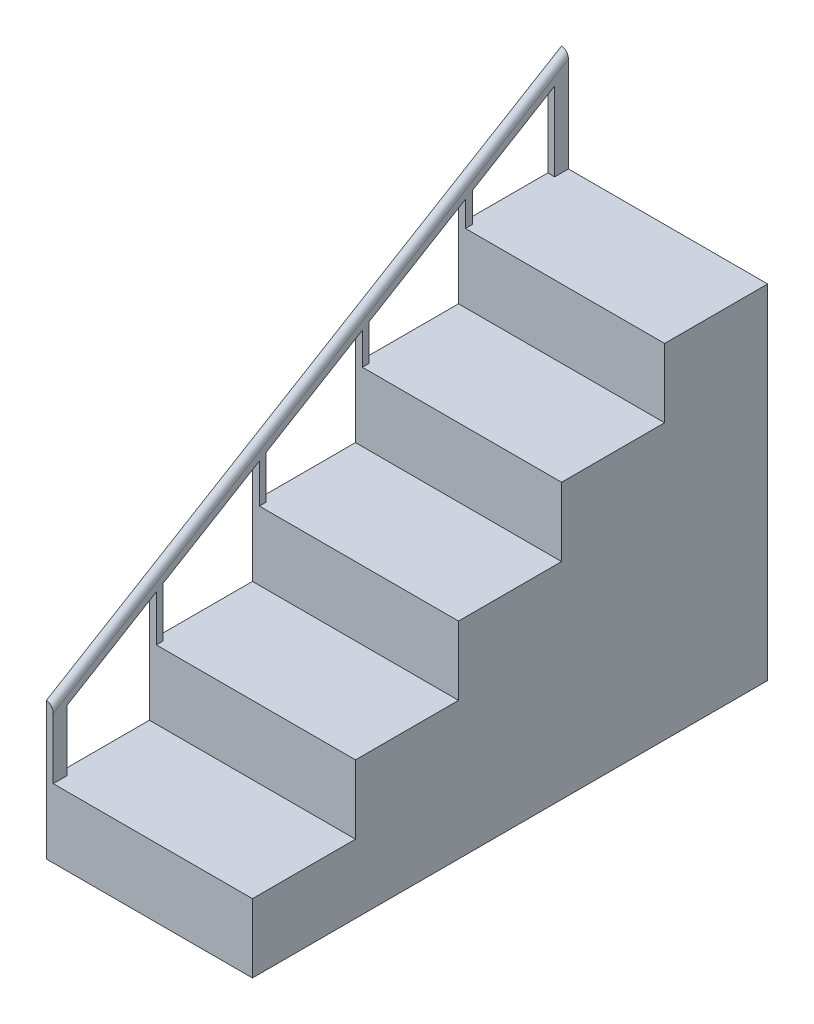
ISO-10303-21;
HEADER;
FILE_DESCRIPTION(('STEP AP214'),'2;1');
FILE_NAME('part.step','',(''),(''),'','','');
FILE_SCHEMA(('AUTOMOTIVE_DESIGN { 1 0 10303 214 1 1 1 1 }'));
ENDSEC;
DATA;
#1=APPLICATION_CONTEXT('core data for automotive mechanical design processes');
#2=APPLICATION_PROTOCOL_DEFINITION('international standard','automotive_design',2000,#1);
#3=PRODUCT_CONTEXT('',#1,'mechanical');
#4=PRODUCT('Part','Part','',(#3));
#5=PRODUCT_RELATED_PRODUCT_CATEGORY('part','',(#4));
#6=PRODUCT_DEFINITION_FORMATION('','',#4);
#7=PRODUCT_DEFINITION_CONTEXT('part definition',#1,'design');
#8=PRODUCT_DEFINITION('design','',#6,#7);
#9=PRODUCT_DEFINITION_SHAPE('','',#8);
#10=(LENGTH_UNIT() NAMED_UNIT(*) SI_UNIT(.MILLI.,.METRE.));
#11=(NAMED_UNIT(*) PLANE_ANGLE_UNIT() SI_UNIT($,.RADIAN.));
#12=(NAMED_UNIT(*) SI_UNIT($,.STERADIAN.) SOLID_ANGLE_UNIT());
#13=UNCERTAINTY_MEASURE_WITH_UNIT(LENGTH_MEASURE(1.E-05),#10,'distance_accuracy_value','');
#14=(GEOMETRIC_REPRESENTATION_CONTEXT(3) GLOBAL_UNCERTAINTY_ASSIGNED_CONTEXT((#13)) GLOBAL_UNIT_ASSIGNED_CONTEXT((#10,
#11,#12)) REPRESENTATION_CONTEXT('',''));
#15=CARTESIAN_POINT('',(0.,0.,0.));
#16=DIRECTION('',(0.,0.,1.));
#17=DIRECTION('',(1.,0.,0.));
#18=AXIS2_PLACEMENT_3D('',#15,#16,#17);
#19=CARTESIAN_POINT('',(10.,614.676192420619,-730.));
#20=DIRECTION('',(0.,-0.857492925712544,-0.514495755427526));
#21=DIRECTION('',(0.,0.514495755427527,-0.857492925712544));
#22=AXIS2_PLACEMENT_3D('',#19,#20,#21);
#23=PLANE('',#22);
#24=DIRECTION('',(-1.,0.,0.));
#25=VECTOR('',#24,1.);
#26=CARTESIAN_POINT('',(10.,542.676192420619,-610.));
#27=LINE('',#26,#25);
#28=CARTESIAN_POINT('',(10.,542.676192420619,-610.));
#29=VERTEX_POINT('',#28);
#30=CARTESIAN_POINT('',(0.,542.676192420619,-610.));
#31=VERTEX_POINT('',#30);
#32=EDGE_CURVE('E263',#29,#31,#27,.T.);
#33=ORIENTED_EDGE('',*,*,#32,.T.);
#34=DIRECTION('',(0.,-0.514495755427527,0.857492925712544));
#35=VECTOR('',#34,1.);
#36=CARTESIAN_POINT('',(0.,614.676192420619,-730.));
#37=LINE('',#36,#35);
#38=CARTESIAN_POINT('',(0.,614.676192420619,-730.));
#39=VERTEX_POINT('',#38);
#40=EDGE_CURVE('E395',#39,#31,#37,.T.);
#41=ORIENTED_EDGE('',*,*,#40,.F.);
#42=DIRECTION('',(-1.,0.,0.));
#43=VECTOR('',#42,1.);
#44=CARTESIAN_POINT('',(10.,614.676192420619,-730.));
#45=LINE('',#44,#43);
#46=CARTESIAN_POINT('',(10.,614.676192420619,-730.));
#47=VERTEX_POINT('',#46);
#48=EDGE_CURVE('E415',#47,#39,#45,.T.);
#49=ORIENTED_EDGE('',*,*,#48,.F.);
#50=DIRECTION('',(0.,-0.514495755427527,0.857492925712544));
#51=VECTOR('',#50,1.);
#52=CARTESIAN_POINT('',(10.,614.676192420619,-730.));
#53=LINE('',#52,#51);
#54=EDGE_CURVE('E252',#47,#29,#53,.T.);
#55=ORIENTED_EDGE('',*,*,#54,.T.);
#56=EDGE_LOOP('',(#33,#41,#49,#55));
#57=FACE_BOUND('',#56,.T.);
#58=ADVANCED_FACE('F44',(#57),#23,.T.);
#59=DIRECTION('',(-1.,0.,0.));
#60=VECTOR('',#59,1.);
#61=CARTESIAN_POINT('',(10.,536.676192420619,-600.));
#62=LINE('',#61,#60);
#63=CARTESIAN_POINT('',(10.,536.676192420619,-600.));
#64=VERTEX_POINT('',#63);
#65=CARTESIAN_POINT('',(0.,536.676192420619,-600.));
#66=VERTEX_POINT('',#65);
#67=EDGE_CURVE('E257',#64,#66,#62,.T.);
#68=ORIENTED_EDGE('',*,*,#67,.F.);
#69=CARTESIAN_POINT('',(10.,452.676192420619,-460.));
#70=VERTEX_POINT('',#69);
#71=EDGE_CURVE('E240',#64,#70,#53,.T.);
#72=ORIENTED_EDGE('',*,*,#71,.T.);
#73=DIRECTION('',(-1.,0.,0.));
#74=VECTOR('',#73,1.);
#75=CARTESIAN_POINT('',(10.,452.676192420619,-460.));
#76=LINE('',#75,#74);
#77=CARTESIAN_POINT('',(0.,452.676192420619,-460.));
#78=VERTEX_POINT('',#77);
#79=EDGE_CURVE('E296',#70,#78,#76,.T.);
#80=ORIENTED_EDGE('',*,*,#79,.T.);
#81=EDGE_CURVE('E260',#66,#78,#37,.T.);
#82=ORIENTED_EDGE('',*,*,#81,.F.);
#83=EDGE_LOOP('',(#68,#72,#80,#82));
#84=FACE_BOUND('',#83,.T.);
#85=ADVANCED_FACE('F258',(#84),#23,.T.);
#86=DIRECTION('',(-1.,0.,0.));
#87=VECTOR('',#86,1.);
#88=CARTESIAN_POINT('',(10.,446.676192420619,-450.));
#89=LINE('',#88,#87);
#90=CARTESIAN_POINT('',(10.,446.676192420619,-450.));
#91=VERTEX_POINT('',#90);
#92=CARTESIAN_POINT('',(0.,446.676192420619,-450.));
#93=VERTEX_POINT('',#92);
#94=EDGE_CURVE('E292',#91,#93,#89,.T.);
#95=ORIENTED_EDGE('',*,*,#94,.F.);
#96=CARTESIAN_POINT('',(10.,362.676192420619,-310.));
#97=VERTEX_POINT('',#96);
#98=EDGE_CURVE('E253',#91,#97,#53,.T.);
#99=ORIENTED_EDGE('',*,*,#98,.T.);
#100=DIRECTION('',(-1.,0.,0.));
#101=VECTOR('',#100,1.);
#102=CARTESIAN_POINT('',(10.,362.676192420619,-310.));
#103=LINE('',#102,#101);
#104=CARTESIAN_POINT('',(0.,362.676192420619,-310.));
#105=VERTEX_POINT('',#104);
#106=EDGE_CURVE('E321',#97,#105,#103,.T.);
#107=ORIENTED_EDGE('',*,*,#106,.T.);
#108=EDGE_CURVE('E548',#93,#105,#37,.T.);
#109=ORIENTED_EDGE('',*,*,#108,.F.);
#110=EDGE_LOOP('',(#95,#99,#107,#109));
#111=FACE_BOUND('',#110,.T.);
#112=ADVANCED_FACE('F629',(#111),#23,.T.);
#113=DIRECTION('',(-1.,0.,0.));
#114=VECTOR('',#113,1.);
#115=CARTESIAN_POINT('',(10.,356.676192420619,-300.));
#116=LINE('',#115,#114);
#117=CARTESIAN_POINT('',(10.,356.676192420619,-300.));
#118=VERTEX_POINT('',#117);
#119=CARTESIAN_POINT('',(0.,356.676192420619,-300.));
#120=VERTEX_POINT('',#119);
#121=EDGE_CURVE('E316',#118,#120,#116,.T.);
#122=ORIENTED_EDGE('',*,*,#121,.F.);
#123=CARTESIAN_POINT('',(10.,272.676192420619,-160.));
#124=VERTEX_POINT('',#123);
#125=EDGE_CURVE('E544',#118,#124,#53,.T.);
#126=ORIENTED_EDGE('',*,*,#125,.T.);
#127=DIRECTION('',(-1.,0.,0.));
#128=VECTOR('',#127,1.);
#129=CARTESIAN_POINT('',(10.,272.676192420619,-160.));
#130=LINE('',#129,#128);
#131=CARTESIAN_POINT('',(0.,272.676192420619,-160.));
#132=VERTEX_POINT('',#131);
#133=EDGE_CURVE('E347',#124,#132,#130,.T.);
#134=ORIENTED_EDGE('',*,*,#133,.T.);
#135=EDGE_CURVE('E551',#120,#132,#37,.T.);
#136=ORIENTED_EDGE('',*,*,#135,.F.);
#137=EDGE_LOOP('',(#122,#126,#134,#136));
#138=FACE_BOUND('',#137,.T.);
#139=ADVANCED_FACE('F608',(#138),#23,.T.);
#140=CARTESIAN_POINT('',(300.,0.,-750.));
#141=DIRECTION('',(0.,1.,0.));
#142=DIRECTION('',(0.,0.,1.));
#143=AXIS2_PLACEMENT_3D('',#140,#141,#142);
#144=PLANE('',#143);
#145=DIRECTION('',(0.,0.,-1.));
#146=VECTOR('',#145,1.);
#147=CARTESIAN_POINT('',(0.,0.,-750.));
#148=LINE('',#147,#146);
#149=CARTESIAN_POINT('',(0.,0.,0.));
#150=VERTEX_POINT('',#149);
#151=CARTESIAN_POINT('',(0.,0.,-750.));
#152=VERTEX_POINT('',#151);
#153=EDGE_CURVE('E410',#150,#152,#148,.T.);
#154=ORIENTED_EDGE('',*,*,#153,.T.);
#155=DIRECTION('',(-1.,0.,0.));
#156=VECTOR('',#155,1.);
#157=CARTESIAN_POINT('',(300.,0.,-750.));
#158=LINE('',#157,#156);
#159=CARTESIAN_POINT('',(300.,0.,-750.));
#160=VERTEX_POINT('',#159);
#161=EDGE_CURVE('E536',#160,#152,#158,.T.);
#162=ORIENTED_EDGE('',*,*,#161,.F.);
#163=DIRECTION('',(0.,0.,-1.));
#164=VECTOR('',#163,1.);
#165=CARTESIAN_POINT('',(300.,0.,-750.));
#166=LINE('',#165,#164);
#167=CARTESIAN_POINT('',(300.,0.,0.));
#168=VERTEX_POINT('',#167);
#169=EDGE_CURVE('E421',#168,#160,#166,.T.);
#170=ORIENTED_EDGE('',*,*,#169,.F.);
#171=DIRECTION('',(-1.,0.,0.));
#172=VECTOR('',#171,1.);
#173=CARTESIAN_POINT('',(300.,0.,0.));
#174=LINE('',#173,#172);
#175=EDGE_CURVE('E459',#168,#150,#174,.T.);
#176=ORIENTED_EDGE('',*,*,#175,.T.);
#177=EDGE_LOOP('',(#154,#162,#170,#176));
#178=FACE_BOUND('',#177,.T.);
#179=ADVANCED_FACE('F583',(#178),#144,.F.);
#180=CARTESIAN_POINT('',(300.,500.,-750.));
#181=DIRECTION('',(0.,0.,1.));
#182=DIRECTION('',(1.,0.,0.));
#183=AXIS2_PLACEMENT_3D('',#180,#181,#182);
#184=PLANE('',#183);
#185=DIRECTION('',(0.,1.,0.));
#186=VECTOR('',#185,1.);
#187=CARTESIAN_POINT('',(0.,500.,-750.));
#188=LINE('',#187,#186);
#189=CARTESIAN_POINT('',(0.,650.,-750.));
#190=VERTEX_POINT('',#189);
#191=EDGE_CURVE('E463',#152,#190,#188,.T.);
#192=ORIENTED_EDGE('',*,*,#191,.T.);
#193=CARTESIAN_POINT('',(0.,638.338096210309,-750.));
#194=DIRECTION('',(0.,0.,1.));
#195=DIRECTION('',(0.,-1.,0.));
#196=AXIS2_PLACEMENT_3D('',#193,#194,#195);
#197=ELLIPSE('',#196,11.6619037896906,10.);
#198=CARTESIAN_POINT('',(10.,638.338096210309,-750.));
#199=VERTEX_POINT('',#198);
#200=EDGE_CURVE('E67',#190,#199,#197,.F.);
#201=ORIENTED_EDGE('',*,*,#200,.T.);
#202=DIRECTION('',(0.,-1.,0.));
#203=VECTOR('',#202,1.);
#204=CARTESIAN_POINT('',(10.,500.,-750.));
#205=LINE('',#204,#203);
#206=CARTESIAN_POINT('',(10.,500.,-750.));
#207=VERTEX_POINT('',#206);
#208=EDGE_CURVE('E387',#199,#207,#205,.T.);
#209=ORIENTED_EDGE('',*,*,#208,.T.);
#210=DIRECTION('',(-1.,0.,0.));
#211=VECTOR('',#210,1.);
#212=CARTESIAN_POINT('',(300.,500.,-750.));
#213=LINE('',#212,#211);
#214=CARTESIAN_POINT('',(300.,500.,-750.));
#215=VERTEX_POINT('',#214);
#216=EDGE_CURVE('E532',#215,#207,#213,.T.);
#217=ORIENTED_EDGE('',*,*,#216,.F.);
#218=DIRECTION('',(0.,1.,0.));
#219=VECTOR('',#218,1.);
#220=CARTESIAN_POINT('',(300.,500.,-750.));
#221=LINE('',#220,#219);
#222=EDGE_CURVE('E425',#160,#215,#221,.T.);
#223=ORIENTED_EDGE('',*,*,#222,.F.);
#224=ORIENTED_EDGE('',*,*,#161,.T.);
#225=EDGE_LOOP('',(#192,#201,#209,#217,#223,#224));
#226=FACE_BOUND('',#225,.T.);
#227=ADVANCED_FACE('F663',(#226),#184,.F.);
#228=CARTESIAN_POINT('',(300.,500.,-600.));
#229=DIRECTION('',(0.,-1.,0.));
#230=DIRECTION('',(0.,0.,-1.));
#231=AXIS2_PLACEMENT_3D('',#228,#229,#230);
#232=PLANE('',#231);
#233=DIRECTION('',(0.,0.,1.));
#234=VECTOR('',#233,1.);
#235=CARTESIAN_POINT('',(0.,500.,-600.));
#236=LINE('',#235,#234);
#237=CARTESIAN_POINT('',(0.,500.,-730.));
#238=VERTEX_POINT('',#237);
#239=CARTESIAN_POINT('',(0.,500.,-610.));
#240=VERTEX_POINT('',#239);
#241=EDGE_CURVE('E466',#238,#240,#236,.T.);
#242=ORIENTED_EDGE('',*,*,#241,.T.);
#243=DIRECTION('',(-1.,0.,0.));
#244=VECTOR('',#243,1.);
#245=CARTESIAN_POINT('',(10.,500.,-610.));
#246=LINE('',#245,#244);
#247=CARTESIAN_POINT('',(10.,500.,-610.));
#248=VERTEX_POINT('',#247);
#249=EDGE_CURVE('E285',#248,#240,#246,.T.);
#250=ORIENTED_EDGE('',*,*,#249,.F.);
#251=DIRECTION('',(0.,0.,1.));
#252=VECTOR('',#251,1.);
#253=CARTESIAN_POINT('',(10.,500.,-610.));
#254=LINE('',#253,#252);
#255=CARTESIAN_POINT('',(10.,500.,-600.));
#256=VERTEX_POINT('',#255);
#257=EDGE_CURVE('E272',#248,#256,#254,.T.);
#258=ORIENTED_EDGE('',*,*,#257,.T.);
#259=DIRECTION('',(-1.,0.,0.));
#260=VECTOR('',#259,1.);
#261=CARTESIAN_POINT('',(300.,500.,-600.));
#262=LINE('',#261,#260);
#263=CARTESIAN_POINT('',(300.,500.,-600.));
#264=VERTEX_POINT('',#263);
#265=EDGE_CURVE('E270',#264,#256,#262,.T.);
#266=ORIENTED_EDGE('',*,*,#265,.F.);
#267=DIRECTION('',(0.,0.,1.));
#268=VECTOR('',#267,1.);
#269=CARTESIAN_POINT('',(300.,500.,-600.));
#270=LINE('',#269,#268);
#271=EDGE_CURVE('E429',#215,#264,#270,.T.);
#272=ORIENTED_EDGE('',*,*,#271,.F.);
#273=ORIENTED_EDGE('',*,*,#216,.T.);
#274=DIRECTION('',(0.,0.,1.));
#275=VECTOR('',#274,1.);
#276=CARTESIAN_POINT('',(10.,500.,-750.));
#277=LINE('',#276,#275);
#278=CARTESIAN_POINT('',(10.,500.,-730.));
#279=VERTEX_POINT('',#278);
#280=EDGE_CURVE('E367',#207,#279,#277,.T.);
#281=ORIENTED_EDGE('',*,*,#280,.T.);
#282=DIRECTION('',(-1.,0.,0.));
#283=VECTOR('',#282,1.);
#284=CARTESIAN_POINT('',(10.,500.,-730.));
#285=LINE('',#284,#283);
#286=EDGE_CURVE('E390',#279,#238,#285,.T.);
#287=ORIENTED_EDGE('',*,*,#286,.T.);
#288=EDGE_LOOP('',(#242,#250,#258,#266,#272,#273,#281,#287));
#289=FACE_BOUND('',#288,.T.);
#290=ADVANCED_FACE('F648',(#289),#232,.F.);
#291=CARTESIAN_POINT('',(300.,400.,-600.));
#292=DIRECTION('',(0.,0.,-1.));
#293=DIRECTION('',(-1.,0.,0.));
#294=AXIS2_PLACEMENT_3D('',#291,#292,#293);
#295=PLANE('',#294);
#296=DIRECTION('',(0.,-1.,0.));
#297=VECTOR('',#296,1.);
#298=CARTESIAN_POINT('',(0.,400.,-600.));
#299=LINE('',#298,#297);
#300=CARTESIAN_POINT('',(0.,400.,-600.));
#301=VERTEX_POINT('',#300);
#302=EDGE_CURVE('E469',#66,#301,#299,.T.);
#303=ORIENTED_EDGE('',*,*,#302,.T.);
#304=DIRECTION('',(-1.,0.,0.));
#305=VECTOR('',#304,1.);
#306=CARTESIAN_POINT('',(300.,400.,-600.));
#307=LINE('',#306,#305);
#308=CARTESIAN_POINT('',(300.,400.,-600.));
#309=VERTEX_POINT('',#308);
#310=EDGE_CURVE('E526',#309,#301,#307,.T.);
#311=ORIENTED_EDGE('',*,*,#310,.F.);
#312=DIRECTION('',(0.,-1.,0.));
#313=VECTOR('',#312,1.);
#314=CARTESIAN_POINT('',(300.,400.,-600.));
#315=LINE('',#314,#313);
#316=EDGE_CURVE('E432',#264,#309,#315,.T.);
#317=ORIENTED_EDGE('',*,*,#316,.F.);
#318=ORIENTED_EDGE('',*,*,#265,.T.);
#319=DIRECTION('',(0.,1.,0.));
#320=VECTOR('',#319,1.);
#321=CARTESIAN_POINT('',(10.,500.,-600.));
#322=LINE('',#321,#320);
#323=EDGE_CURVE('E245',#256,#64,#322,.T.);
#324=ORIENTED_EDGE('',*,*,#323,.T.);
#325=ORIENTED_EDGE('',*,*,#67,.T.);
#326=EDGE_LOOP('',(#303,#311,#317,#318,#324,#325));
#327=FACE_BOUND('',#326,.T.);
#328=ADVANCED_FACE('F267',(#327),#295,.F.);
#329=CARTESIAN_POINT('',(300.,400.,-450.));
#330=DIRECTION('',(0.,-1.,0.));
#331=DIRECTION('',(0.,0.,-1.));
#332=AXIS2_PLACEMENT_3D('',#329,#330,#331);
#333=PLANE('',#332);
#334=DIRECTION('',(0.,0.,1.));
#335=VECTOR('',#334,1.);
#336=CARTESIAN_POINT('',(0.,400.,-450.));
#337=LINE('',#336,#335);
#338=CARTESIAN_POINT('',(0.,400.,-460.));
#339=VERTEX_POINT('',#338);
#340=EDGE_CURVE('E472',#301,#339,#337,.T.);
#341=ORIENTED_EDGE('',*,*,#340,.T.);
#342=DIRECTION('',(-1.,0.,0.));
#343=VECTOR('',#342,1.);
#344=CARTESIAN_POINT('',(10.,400.,-460.));
#345=LINE('',#344,#343);
#346=CARTESIAN_POINT('',(10.,400.,-460.));
#347=VERTEX_POINT('',#346);
#348=EDGE_CURVE('E299',#347,#339,#345,.T.);
#349=ORIENTED_EDGE('',*,*,#348,.F.);
#350=DIRECTION('',(0.,0.,1.));
#351=VECTOR('',#350,1.);
#352=CARTESIAN_POINT('',(10.,400.,-460.));
#353=LINE('',#352,#351);
#354=CARTESIAN_POINT('',(10.,400.,-450.));
#355=VERTEX_POINT('',#354);
#356=EDGE_CURVE('E307',#347,#355,#353,.T.);
#357=ORIENTED_EDGE('',*,*,#356,.T.);
#358=DIRECTION('',(-1.,0.,0.));
#359=VECTOR('',#358,1.);
#360=CARTESIAN_POINT('',(300.,400.,-450.));
#361=LINE('',#360,#359);
#362=CARTESIAN_POINT('',(300.,400.,-450.));
#363=VERTEX_POINT('',#362);
#364=EDGE_CURVE('E522',#363,#355,#361,.T.);
#365=ORIENTED_EDGE('',*,*,#364,.F.);
#366=DIRECTION('',(0.,0.,1.));
#367=VECTOR('',#366,1.);
#368=CARTESIAN_POINT('',(300.,400.,-450.));
#369=LINE('',#368,#367);
#370=EDGE_CURVE('E435',#309,#363,#369,.T.);
#371=ORIENTED_EDGE('',*,*,#370,.F.);
#372=ORIENTED_EDGE('',*,*,#310,.T.);
#373=EDGE_LOOP('',(#341,#349,#357,#365,#371,#372));
#374=FACE_BOUND('',#373,.T.);
#375=ADVANCED_FACE('F638',(#374),#333,.F.);
#376=CARTESIAN_POINT('',(300.,300.,-450.));
#377=DIRECTION('',(0.,0.,-1.));
#378=DIRECTION('',(-1.,0.,0.));
#379=AXIS2_PLACEMENT_3D('',#376,#377,#378);
#380=PLANE('',#379);
#381=DIRECTION('',(0.,-1.,0.));
#382=VECTOR('',#381,1.);
#383=CARTESIAN_POINT('',(0.,300.,-450.));
#384=LINE('',#383,#382);
#385=CARTESIAN_POINT('',(0.,300.,-450.));
#386=VERTEX_POINT('',#385);
#387=EDGE_CURVE('E475',#93,#386,#384,.T.);
#388=ORIENTED_EDGE('',*,*,#387,.T.);
#389=DIRECTION('',(-1.,0.,0.));
#390=VECTOR('',#389,1.);
#391=CARTESIAN_POINT('',(300.,300.,-450.));
#392=LINE('',#391,#390);
#393=CARTESIAN_POINT('',(300.,300.,-450.));
#394=VERTEX_POINT('',#393);
#395=EDGE_CURVE('E518',#394,#386,#392,.T.);
#396=ORIENTED_EDGE('',*,*,#395,.F.);
#397=DIRECTION('',(0.,-1.,0.));
#398=VECTOR('',#397,1.);
#399=CARTESIAN_POINT('',(300.,300.,-450.));
#400=LINE('',#399,#398);
#401=EDGE_CURVE('E438',#363,#394,#400,.T.);
#402=ORIENTED_EDGE('',*,*,#401,.F.);
#403=ORIENTED_EDGE('',*,*,#364,.T.);
#404=DIRECTION('',(0.,1.,0.));
#405=VECTOR('',#404,1.);
#406=CARTESIAN_POINT('',(10.,400.,-450.));
#407=LINE('',#406,#405);
#408=EDGE_CURVE('E310',#355,#91,#407,.T.);
#409=ORIENTED_EDGE('',*,*,#408,.T.);
#410=ORIENTED_EDGE('',*,*,#94,.T.);
#411=EDGE_LOOP('',(#388,#396,#402,#403,#409,#410));
#412=FACE_BOUND('',#411,.T.);
#413=ADVANCED_FACE('F633',(#412),#380,.F.);
#414=CARTESIAN_POINT('',(300.,300.,-300.));
#415=DIRECTION('',(0.,-1.,0.));
#416=DIRECTION('',(0.,0.,-1.));
#417=AXIS2_PLACEMENT_3D('',#414,#415,#416);
#418=PLANE('',#417);
#419=DIRECTION('',(0.,0.,1.));
#420=VECTOR('',#419,1.);
#421=CARTESIAN_POINT('',(0.,300.,-300.));
#422=LINE('',#421,#420);
#423=CARTESIAN_POINT('',(0.,300.,-310.));
#424=VERTEX_POINT('',#423);
#425=EDGE_CURVE('E478',#386,#424,#422,.T.);
#426=ORIENTED_EDGE('',*,*,#425,.T.);
#427=DIRECTION('',(-1.,0.,0.));
#428=VECTOR('',#427,1.);
#429=CARTESIAN_POINT('',(10.,300.,-310.));
#430=LINE('',#429,#428);
#431=CARTESIAN_POINT('',(10.,300.,-310.));
#432=VERTEX_POINT('',#431);
#433=EDGE_CURVE('E324',#432,#424,#430,.T.);
#434=ORIENTED_EDGE('',*,*,#433,.F.);
#435=DIRECTION('',(0.,0.,1.));
#436=VECTOR('',#435,1.);
#437=CARTESIAN_POINT('',(10.,300.,-310.));
#438=LINE('',#437,#436);
#439=CARTESIAN_POINT('',(10.,300.,-300.));
#440=VERTEX_POINT('',#439);
#441=EDGE_CURVE('E332',#432,#440,#438,.T.);
#442=ORIENTED_EDGE('',*,*,#441,.T.);
#443=DIRECTION('',(-1.,0.,0.));
#444=VECTOR('',#443,1.);
#445=CARTESIAN_POINT('',(300.,300.,-300.));
#446=LINE('',#445,#444);
#447=CARTESIAN_POINT('',(300.,300.,-300.));
#448=VERTEX_POINT('',#447);
#449=EDGE_CURVE('E514',#448,#440,#446,.T.);
#450=ORIENTED_EDGE('',*,*,#449,.F.);
#451=DIRECTION('',(0.,0.,1.));
#452=VECTOR('',#451,1.);
#453=CARTESIAN_POINT('',(300.,300.,-300.));
#454=LINE('',#453,#452);
#455=EDGE_CURVE('E441',#394,#448,#454,.T.);
#456=ORIENTED_EDGE('',*,*,#455,.F.);
#457=ORIENTED_EDGE('',*,*,#395,.T.);
#458=EDGE_LOOP('',(#426,#434,#442,#450,#456,#457));
#459=FACE_BOUND('',#458,.T.);
#460=ADVANCED_FACE('F620',(#459),#418,.F.);
#461=CARTESIAN_POINT('',(300.,200.,-300.));
#462=DIRECTION('',(0.,0.,-1.));
#463=DIRECTION('',(-1.,0.,0.));
#464=AXIS2_PLACEMENT_3D('',#461,#462,#463);
#465=PLANE('',#464);
#466=DIRECTION('',(0.,-1.,0.));
#467=VECTOR('',#466,1.);
#468=CARTESIAN_POINT('',(0.,200.,-300.));
#469=LINE('',#468,#467);
#470=CARTESIAN_POINT('',(0.,200.,-300.));
#471=VERTEX_POINT('',#470);
#472=EDGE_CURVE('E481',#120,#471,#469,.T.);
#473=ORIENTED_EDGE('',*,*,#472,.T.);
#474=DIRECTION('',(-1.,0.,0.));
#475=VECTOR('',#474,1.);
#476=CARTESIAN_POINT('',(300.,200.,-300.));
#477=LINE('',#476,#475);
#478=CARTESIAN_POINT('',(300.,200.,-300.));
#479=VERTEX_POINT('',#478);
#480=EDGE_CURVE('E510',#479,#471,#477,.T.);
#481=ORIENTED_EDGE('',*,*,#480,.F.);
#482=DIRECTION('',(0.,-1.,0.));
#483=VECTOR('',#482,1.);
#484=CARTESIAN_POINT('',(300.,200.,-300.));
#485=LINE('',#484,#483);
#486=EDGE_CURVE('E444',#448,#479,#485,.T.);
#487=ORIENTED_EDGE('',*,*,#486,.F.);
#488=ORIENTED_EDGE('',*,*,#449,.T.);
#489=DIRECTION('',(0.,1.,0.));
#490=VECTOR('',#489,1.);
#491=CARTESIAN_POINT('',(10.,300.,-300.));
#492=LINE('',#491,#490);
#493=EDGE_CURVE('E336',#440,#118,#492,.T.);
#494=ORIENTED_EDGE('',*,*,#493,.T.);
#495=ORIENTED_EDGE('',*,*,#121,.T.);
#496=EDGE_LOOP('',(#473,#481,#487,#488,#494,#495));
#497=FACE_BOUND('',#496,.T.);
#498=ADVANCED_FACE('F612',(#497),#465,.F.);
#499=CARTESIAN_POINT('',(300.,200.,-150.));
#500=DIRECTION('',(0.,-1.,0.));
#501=DIRECTION('',(0.,0.,-1.));
#502=AXIS2_PLACEMENT_3D('',#499,#500,#501);
#503=PLANE('',#502);
#504=DIRECTION('',(0.,0.,1.));
#505=VECTOR('',#504,1.);
#506=CARTESIAN_POINT('',(0.,200.,-150.));
#507=LINE('',#506,#505);
#508=CARTESIAN_POINT('',(0.,200.,-160.));
#509=VERTEX_POINT('',#508);
#510=EDGE_CURVE('E484',#471,#509,#507,.T.);
#511=ORIENTED_EDGE('',*,*,#510,.T.);
#512=DIRECTION('',(-1.,0.,0.));
#513=VECTOR('',#512,1.);
#514=CARTESIAN_POINT('',(10.,200.,-160.));
#515=LINE('',#514,#513);
#516=CARTESIAN_POINT('',(10.,200.,-160.));
#517=VERTEX_POINT('',#516);
#518=EDGE_CURVE('E350',#517,#509,#515,.T.);
#519=ORIENTED_EDGE('',*,*,#518,.F.);
#520=DIRECTION('',(0.,0.,1.));
#521=VECTOR('',#520,1.);
#522=CARTESIAN_POINT('',(10.,200.,-160.));
#523=LINE('',#522,#521);
#524=CARTESIAN_POINT('',(10.,200.,-150.));
#525=VERTEX_POINT('',#524);
#526=EDGE_CURVE('E357',#517,#525,#523,.T.);
#527=ORIENTED_EDGE('',*,*,#526,.T.);
#528=DIRECTION('',(-1.,0.,0.));
#529=VECTOR('',#528,1.);
#530=CARTESIAN_POINT('',(300.,200.,-150.));
#531=LINE('',#530,#529);
#532=CARTESIAN_POINT('',(300.,200.,-150.));
#533=VERTEX_POINT('',#532);
#534=EDGE_CURVE('E506',#533,#525,#531,.T.);
#535=ORIENTED_EDGE('',*,*,#534,.F.);
#536=DIRECTION('',(0.,0.,1.));
#537=VECTOR('',#536,1.);
#538=CARTESIAN_POINT('',(300.,200.,-150.));
#539=LINE('',#538,#537);
#540=EDGE_CURVE('E447',#479,#533,#539,.T.);
#541=ORIENTED_EDGE('',*,*,#540,.F.);
#542=ORIENTED_EDGE('',*,*,#480,.T.);
#543=EDGE_LOOP('',(#511,#519,#527,#535,#541,#542));
#544=FACE_BOUND('',#543,.T.);
#545=ADVANCED_FACE('F598',(#544),#503,.F.);
#546=CARTESIAN_POINT('',(300.,100.,-150.));
#547=DIRECTION('',(0.,0.,-1.));
#548=DIRECTION('',(-1.,0.,0.));
#549=AXIS2_PLACEMENT_3D('',#546,#547,#548);
#550=PLANE('',#549);
#551=DIRECTION('',(0.,-1.,0.));
#552=VECTOR('',#551,1.);
#553=CARTESIAN_POINT('',(0.,100.,-150.));
#554=LINE('',#553,#552);
#555=CARTESIAN_POINT('',(0.,266.676192420619,-150.));
#556=VERTEX_POINT('',#555);
#557=CARTESIAN_POINT('',(0.,100.,-150.));
#558=VERTEX_POINT('',#557);
#559=EDGE_CURVE('E487',#556,#558,#554,.T.);
#560=ORIENTED_EDGE('',*,*,#559,.T.);
#561=DIRECTION('',(-1.,0.,0.));
#562=VECTOR('',#561,1.);
#563=CARTESIAN_POINT('',(300.,100.,-150.));
#564=LINE('',#563,#562);
#565=CARTESIAN_POINT('',(300.,100.,-150.));
#566=VERTEX_POINT('',#565);
#567=EDGE_CURVE('E502',#566,#558,#564,.T.);
#568=ORIENTED_EDGE('',*,*,#567,.F.);
#569=DIRECTION('',(0.,-1.,0.));
#570=VECTOR('',#569,1.);
#571=CARTESIAN_POINT('',(300.,100.,-150.));
#572=LINE('',#571,#570);
#573=EDGE_CURVE('E450',#533,#566,#572,.T.);
#574=ORIENTED_EDGE('',*,*,#573,.F.);
#575=ORIENTED_EDGE('',*,*,#534,.T.);
#576=DIRECTION('',(0.,1.,0.));
#577=VECTOR('',#576,1.);
#578=CARTESIAN_POINT('',(10.,200.,-150.));
#579=LINE('',#578,#577);
#580=CARTESIAN_POINT('',(10.,266.676192420619,-150.));
#581=VERTEX_POINT('',#580);
#582=EDGE_CURVE('E361',#525,#581,#579,.T.);
#583=ORIENTED_EDGE('',*,*,#582,.T.);
#584=DIRECTION('',(-1.,0.,0.));
#585=VECTOR('',#584,1.);
#586=CARTESIAN_POINT('',(10.,266.676192420619,-150.));
#587=LINE('',#586,#585);
#588=EDGE_CURVE('E342',#581,#556,#587,.T.);
#589=ORIENTED_EDGE('',*,*,#588,.T.);
#590=EDGE_LOOP('',(#560,#568,#574,#575,#583,#589));
#591=FACE_BOUND('',#590,.T.);
#592=ADVANCED_FACE('F592',(#591),#550,.F.);
#593=CARTESIAN_POINT('',(300.,100.,0.));
#594=DIRECTION('',(0.,-1.,0.));
#595=DIRECTION('',(0.,0.,-1.));
#596=AXIS2_PLACEMENT_3D('',#593,#594,#595);
#597=PLANE('',#596);
#598=DIRECTION('',(0.,0.,1.));
#599=VECTOR('',#598,1.);
#600=CARTESIAN_POINT('',(0.,100.,0.));
#601=LINE('',#600,#599);
#602=CARTESIAN_POINT('',(0.,100.,-20.));
#603=VERTEX_POINT('',#602);
#604=EDGE_CURVE('E490',#558,#603,#601,.T.);
#605=ORIENTED_EDGE('',*,*,#604,.T.);
#606=DIRECTION('',(-1.,0.,0.));
#607=VECTOR('',#606,1.);
#608=CARTESIAN_POINT('',(10.,100.,-20.));
#609=LINE('',#608,#607);
#610=CARTESIAN_POINT('',(10.,100.,-20.));
#611=VERTEX_POINT('',#610);
#612=EDGE_CURVE('E406',#611,#603,#609,.T.);
#613=ORIENTED_EDGE('',*,*,#612,.F.);
#614=DIRECTION('',(0.,0.,1.));
#615=VECTOR('',#614,1.);
#616=CARTESIAN_POINT('',(10.,100.,-20.));
#617=LINE('',#616,#615);
#618=CARTESIAN_POINT('',(10.,100.,0.));
#619=VERTEX_POINT('',#618);
#620=EDGE_CURVE('E381',#611,#619,#617,.T.);
#621=ORIENTED_EDGE('',*,*,#620,.T.);
#622=DIRECTION('',(-1.,0.,0.));
#623=VECTOR('',#622,1.);
#624=CARTESIAN_POINT('',(300.,100.,0.));
#625=LINE('',#624,#623);
#626=CARTESIAN_POINT('',(300.,100.,0.));
#627=VERTEX_POINT('',#626);
#628=EDGE_CURVE('E498',#627,#619,#625,.T.);
#629=ORIENTED_EDGE('',*,*,#628,.F.);
#630=DIRECTION('',(0.,0.,1.));
#631=VECTOR('',#630,1.);
#632=CARTESIAN_POINT('',(300.,100.,0.));
#633=LINE('',#632,#631);
#634=EDGE_CURVE('E453',#566,#627,#633,.T.);
#635=ORIENTED_EDGE('',*,*,#634,.F.);
#636=ORIENTED_EDGE('',*,*,#567,.T.);
#637=EDGE_LOOP('',(#605,#613,#621,#629,#635,#636));
#638=FACE_BOUND('',#637,.T.);
#639=ADVANCED_FACE('F569',(#638),#597,.F.);
#640=CARTESIAN_POINT('',(300.,0.,0.));
#641=DIRECTION('',(0.,0.,-1.));
#642=DIRECTION('',(-1.,0.,0.));
#643=AXIS2_PLACEMENT_3D('',#640,#641,#642);
#644=PLANE('',#643);
#645=DIRECTION('',(0.,1.,0.));
#646=VECTOR('',#645,1.);
#647=CARTESIAN_POINT('',(10.,100.,0.));
#648=LINE('',#647,#646);
#649=CARTESIAN_POINT('',(10.,188.338096210309,0.));
#650=VERTEX_POINT('',#649);
#651=EDGE_CURVE('E384',#619,#650,#648,.T.);
#652=ORIENTED_EDGE('',*,*,#651,.T.);
#653=CARTESIAN_POINT('',(0.,188.338096210309,0.));
#654=DIRECTION('',(0.,0.,-1.));
#655=DIRECTION('',(0.,-1.,0.));
#656=AXIS2_PLACEMENT_3D('',#653,#654,#655);
#657=ELLIPSE('',#656,11.6619037896906,10.);
#658=CARTESIAN_POINT('',(0.,200.,0.));
#659=VERTEX_POINT('',#658);
#660=EDGE_CURVE('E11',#650,#659,#657,.F.);
#661=ORIENTED_EDGE('',*,*,#660,.T.);
#662=DIRECTION('',(0.,-1.,0.));
#663=VECTOR('',#662,1.);
#664=CARTESIAN_POINT('',(0.,0.,0.));
#665=LINE('',#664,#663);
#666=EDGE_CURVE('E426',#659,#150,#665,.T.);
#667=ORIENTED_EDGE('',*,*,#666,.T.);
#668=ORIENTED_EDGE('',*,*,#175,.F.);
#669=DIRECTION('',(0.,-1.,0.));
#670=VECTOR('',#669,1.);
#671=CARTESIAN_POINT('',(300.,0.,0.));
#672=LINE('',#671,#670);
#673=EDGE_CURVE('E456',#627,#168,#672,.T.);
#674=ORIENTED_EDGE('',*,*,#673,.F.);
#675=ORIENTED_EDGE('',*,*,#628,.T.);
#676=EDGE_LOOP('',(#652,#661,#667,#668,#674,#675));
#677=FACE_BOUND('',#676,.T.);
#678=ADVANCED_FACE('F573',(#677),#644,.F.);
#679=CARTESIAN_POINT('',(300.,0.,0.));
#680=DIRECTION('',(-1.,0.,0.));
#681=DIRECTION('',(0.,0.,1.));
#682=AXIS2_PLACEMENT_3D('',#679,#680,#681);
#683=PLANE('',#682);
#684=ORIENTED_EDGE('',*,*,#169,.T.);
#685=ORIENTED_EDGE('',*,*,#222,.T.);
#686=ORIENTED_EDGE('',*,*,#271,.T.);
#687=ORIENTED_EDGE('',*,*,#316,.T.);
#688=ORIENTED_EDGE('',*,*,#370,.T.);
#689=ORIENTED_EDGE('',*,*,#401,.T.);
#690=ORIENTED_EDGE('',*,*,#455,.T.);
#691=ORIENTED_EDGE('',*,*,#486,.T.);
#692=ORIENTED_EDGE('',*,*,#540,.T.);
#693=ORIENTED_EDGE('',*,*,#573,.T.);
#694=ORIENTED_EDGE('',*,*,#634,.T.);
#695=ORIENTED_EDGE('',*,*,#673,.T.);
#696=EDGE_LOOP('',(#684,#685,#686,#687,#688,#689,#690,#691,#692,#693,#694,#695));
#697=FACE_BOUND('',#696,.T.);
#698=ADVANCED_FACE('F586',(#697),#683,.F.);
#699=CARTESIAN_POINT('',(0.,0.,0.));
#700=DIRECTION('',(-1.,0.,0.));
#701=DIRECTION('',(0.,0.,1.));
#702=AXIS2_PLACEMENT_3D('',#699,#700,#701);
#703=PLANE('',#702);
#704=ORIENTED_EDGE('',*,*,#302,.F.);
#705=ORIENTED_EDGE('',*,*,#81,.T.);
#706=DIRECTION('',(0.,-1.,0.));
#707=VECTOR('',#706,1.);
#708=CARTESIAN_POINT('',(0.,400.,-460.));
#709=LINE('',#708,#707);
#710=EDGE_CURVE('E284',#78,#339,#709,.T.);
#711=ORIENTED_EDGE('',*,*,#710,.T.);
#712=ORIENTED_EDGE('',*,*,#340,.F.);
#713=EDGE_LOOP('',(#704,#705,#711,#712));
#714=FACE_BOUND('',#713,.T.);
#715=ORIENTED_EDGE('',*,*,#387,.F.);
#716=ORIENTED_EDGE('',*,*,#108,.T.);
#717=DIRECTION('',(0.,-1.,0.));
#718=VECTOR('',#717,1.);
#719=CARTESIAN_POINT('',(0.,300.,-310.));
#720=LINE('',#719,#718);
#721=EDGE_CURVE('E303',#105,#424,#720,.T.);
#722=ORIENTED_EDGE('',*,*,#721,.T.);
#723=ORIENTED_EDGE('',*,*,#425,.F.);
#724=EDGE_LOOP('',(#715,#716,#722,#723));
#725=FACE_BOUND('',#724,.T.);
#726=ORIENTED_EDGE('',*,*,#472,.F.);
#727=ORIENTED_EDGE('',*,*,#135,.T.);
#728=DIRECTION('',(0.,-1.,0.));
#729=VECTOR('',#728,1.);
#730=CARTESIAN_POINT('',(0.,200.,-160.));
#731=LINE('',#730,#729);
#732=EDGE_CURVE('E328',#132,#509,#731,.T.);
#733=ORIENTED_EDGE('',*,*,#732,.T.);
#734=ORIENTED_EDGE('',*,*,#510,.F.);
#735=EDGE_LOOP('',(#726,#727,#733,#734));
#736=FACE_BOUND('',#735,.T.);
#737=ORIENTED_EDGE('',*,*,#559,.F.);
#738=CARTESIAN_POINT('',(0.,188.676192420619,-20.));
#739=VERTEX_POINT('',#738);
#740=EDGE_CURVE('E394',#556,#739,#37,.T.);
#741=ORIENTED_EDGE('',*,*,#740,.T.);
#742=DIRECTION('',(0.,-1.,0.));
#743=VECTOR('',#742,1.);
#744=CARTESIAN_POINT('',(0.,100.,-20.));
#745=LINE('',#744,#743);
#746=EDGE_CURVE('E399',#739,#603,#745,.T.);
#747=ORIENTED_EDGE('',*,*,#746,.T.);
#748=ORIENTED_EDGE('',*,*,#604,.F.);
#749=EDGE_LOOP('',(#737,#741,#747,#748));
#750=FACE_BOUND('',#749,.T.);
#751=ORIENTED_EDGE('',*,*,#241,.F.);
#752=DIRECTION('',(0.,1.,0.));
#753=VECTOR('',#752,1.);
#754=CARTESIAN_POINT('',(0.,500.,-730.));
#755=LINE('',#754,#753);
#756=EDGE_CURVE('E289',#238,#39,#755,.T.);
#757=ORIENTED_EDGE('',*,*,#756,.T.);
#758=ORIENTED_EDGE('',*,*,#40,.T.);
#759=DIRECTION('',(0.,-1.,0.));
#760=VECTOR('',#759,1.);
#761=CARTESIAN_POINT('',(0.,500.,-610.));
#762=LINE('',#761,#760);
#763=EDGE_CURVE('E278',#31,#240,#762,.T.);
#764=ORIENTED_EDGE('',*,*,#763,.T.);
#765=EDGE_LOOP('',(#751,#757,#758,#764));
#766=FACE_BOUND('',#765,.T.);
#767=ORIENTED_EDGE('',*,*,#153,.F.);
#768=ORIENTED_EDGE('',*,*,#666,.F.);
#769=DIRECTION('',(0.,0.514495755427526,-0.857492925712544));
#770=VECTOR('',#769,1.);
#771=CARTESIAN_POINT('',(0.,650.,-750.));
#772=LINE('',#771,#770);
#773=EDGE_CURVE('E371',#659,#190,#772,.T.);
#774=ORIENTED_EDGE('',*,*,#773,.T.);
#775=ORIENTED_EDGE('',*,*,#191,.F.);
#776=EDGE_LOOP('',(#767,#768,#774,#775));
#777=FACE_BOUND('',#776,.T.);
#778=ADVANCED_FACE('F556',(#714,#725,#736,#750,#766,#777),#703,.T.);
#779=CARTESIAN_POINT('',(10.,100.,-20.));
#780=DIRECTION('',(0.,0.,-1.));
#781=DIRECTION('',(-1.,0.,0.));
#782=AXIS2_PLACEMENT_3D('',#779,#780,#781);
#783=PLANE('',#782);
#784=ORIENTED_EDGE('',*,*,#746,.F.);
#785=DIRECTION('',(-1.,0.,0.));
#786=VECTOR('',#785,1.);
#787=CARTESIAN_POINT('',(10.,188.676192420619,-20.));
#788=LINE('',#787,#786);
#789=CARTESIAN_POINT('',(10.,188.676192420619,-20.));
#790=VERTEX_POINT('',#789);
#791=EDGE_CURVE('E411',#790,#739,#788,.T.);
#792=ORIENTED_EDGE('',*,*,#791,.F.);
#793=DIRECTION('',(0.,-1.,0.));
#794=VECTOR('',#793,1.);
#795=CARTESIAN_POINT('',(10.,100.,-20.));
#796=LINE('',#795,#794);
#797=EDGE_CURVE('E377',#790,#611,#796,.T.);
#798=ORIENTED_EDGE('',*,*,#797,.T.);
#799=ORIENTED_EDGE('',*,*,#612,.T.);
#800=EDGE_LOOP('',(#784,#792,#798,#799));
#801=FACE_BOUND('',#800,.T.);
#802=ADVANCED_FACE('F566',(#801),#783,.T.);
#803=ORIENTED_EDGE('',*,*,#588,.F.);
#804=EDGE_CURVE('E374',#581,#790,#53,.T.);
#805=ORIENTED_EDGE('',*,*,#804,.T.);
#806=ORIENTED_EDGE('',*,*,#791,.T.);
#807=ORIENTED_EDGE('',*,*,#740,.F.);
#808=EDGE_LOOP('',(#803,#805,#806,#807));
#809=FACE_BOUND('',#808,.T.);
#810=ADVANCED_FACE('F563',(#809),#23,.T.);
#811=CARTESIAN_POINT('',(10.,500.,-730.));
#812=DIRECTION('',(0.,0.,1.));
#813=DIRECTION('',(1.,0.,0.));
#814=AXIS2_PLACEMENT_3D('',#811,#812,#813);
#815=PLANE('',#814);
#816=ORIENTED_EDGE('',*,*,#756,.F.);
#817=ORIENTED_EDGE('',*,*,#286,.F.);
#818=DIRECTION('',(0.,1.,0.));
#819=VECTOR('',#818,1.);
#820=CARTESIAN_POINT('',(10.,500.,-730.));
#821=LINE('',#820,#819);
#822=EDGE_CURVE('E370',#279,#47,#821,.T.);
#823=ORIENTED_EDGE('',*,*,#822,.T.);
#824=ORIENTED_EDGE('',*,*,#48,.T.);
#825=EDGE_LOOP('',(#816,#817,#823,#824));
#826=FACE_BOUND('',#825,.T.);
#827=ADVANCED_FACE('F661',(#826),#815,.T.);
#828=CARTESIAN_POINT('',(10.,0.,0.));
#829=DIRECTION('',(-1.,0.,0.));
#830=DIRECTION('',(0.,0.,1.));
#831=AXIS2_PLACEMENT_3D('',#828,#829,#830);
#832=PLANE('',#831);
#833=ORIENTED_EDGE('',*,*,#208,.F.);
#834=DIRECTION('',(0.,0.514495755427527,-0.857492925712544));
#835=VECTOR('',#834,1.);
#836=CARTESIAN_POINT('',(10.,191.425070742875,-5.14495755427524));
#837=LINE('',#836,#835);
#838=EDGE_CURVE('E53',#199,#650,#837,.F.);
#839=ORIENTED_EDGE('',*,*,#838,.T.);
#840=ORIENTED_EDGE('',*,*,#651,.F.);
#841=ORIENTED_EDGE('',*,*,#620,.F.);
#842=ORIENTED_EDGE('',*,*,#797,.F.);
#843=ORIENTED_EDGE('',*,*,#804,.F.);
#844=ORIENTED_EDGE('',*,*,#582,.F.);
#845=ORIENTED_EDGE('',*,*,#526,.F.);
#846=DIRECTION('',(0.,-1.,0.));
#847=VECTOR('',#846,1.);
#848=CARTESIAN_POINT('',(10.,266.676192420619,-160.));
#849=LINE('',#848,#847);
#850=EDGE_CURVE('E346',#124,#517,#849,.T.);
#851=ORIENTED_EDGE('',*,*,#850,.F.);
#852=ORIENTED_EDGE('',*,*,#125,.F.);
#853=ORIENTED_EDGE('',*,*,#493,.F.);
#854=ORIENTED_EDGE('',*,*,#441,.F.);
#855=DIRECTION('',(0.,-1.,0.));
#856=VECTOR('',#855,1.);
#857=CARTESIAN_POINT('',(10.,356.676192420619,-310.));
#858=LINE('',#857,#856);
#859=EDGE_CURVE('E320',#97,#432,#858,.T.);
#860=ORIENTED_EDGE('',*,*,#859,.F.);
#861=ORIENTED_EDGE('',*,*,#98,.F.);
#862=ORIENTED_EDGE('',*,*,#408,.F.);
#863=ORIENTED_EDGE('',*,*,#356,.F.);
#864=DIRECTION('',(0.,-1.,0.));
#865=VECTOR('',#864,1.);
#866=CARTESIAN_POINT('',(10.,446.676192420619,-460.));
#867=LINE('',#866,#865);
#868=EDGE_CURVE('E248',#70,#347,#867,.T.);
#869=ORIENTED_EDGE('',*,*,#868,.F.);
#870=ORIENTED_EDGE('',*,*,#71,.F.);
#871=ORIENTED_EDGE('',*,*,#323,.F.);
#872=ORIENTED_EDGE('',*,*,#257,.F.);
#873=DIRECTION('',(0.,-1.,0.));
#874=VECTOR('',#873,1.);
#875=CARTESIAN_POINT('',(10.,536.676192420619,-610.));
#876=LINE('',#875,#874);
#877=EDGE_CURVE('E264',#29,#248,#876,.T.);
#878=ORIENTED_EDGE('',*,*,#877,.F.);
#879=ORIENTED_EDGE('',*,*,#54,.F.);
#880=ORIENTED_EDGE('',*,*,#822,.F.);
#881=ORIENTED_EDGE('',*,*,#280,.F.);
#882=EDGE_LOOP('',(#833,#839,#840,#841,#842,#843,#844,#845,#851,#852,#853,#854,#860,#861,#862,
#863,#869,#870,#871,#872,#878,#879,#880,#881));
#883=FACE_BOUND('',#882,.T.);
#884=ADVANCED_FACE('F242',(#883),#832,.F.);
#885=CARTESIAN_POINT('',(10.,200.,-160.));
#886=DIRECTION('',(0.,0.,-1.));
#887=DIRECTION('',(-1.,0.,0.));
#888=AXIS2_PLACEMENT_3D('',#885,#886,#887);
#889=PLANE('',#888);
#890=ORIENTED_EDGE('',*,*,#732,.F.);
#891=ORIENTED_EDGE('',*,*,#133,.F.);
#892=ORIENTED_EDGE('',*,*,#850,.T.);
#893=ORIENTED_EDGE('',*,*,#518,.T.);
#894=EDGE_LOOP('',(#890,#891,#892,#893));
#895=FACE_BOUND('',#894,.T.);
#896=ADVANCED_FACE('F604',(#895),#889,.T.);
#897=CARTESIAN_POINT('',(10.,300.,-310.));
#898=DIRECTION('',(0.,0.,-1.));
#899=DIRECTION('',(-1.,0.,0.));
#900=AXIS2_PLACEMENT_3D('',#897,#898,#899);
#901=PLANE('',#900);
#902=ORIENTED_EDGE('',*,*,#721,.F.);
#903=ORIENTED_EDGE('',*,*,#106,.F.);
#904=ORIENTED_EDGE('',*,*,#859,.T.);
#905=ORIENTED_EDGE('',*,*,#433,.T.);
#906=EDGE_LOOP('',(#902,#903,#904,#905));
#907=FACE_BOUND('',#906,.T.);
#908=ADVANCED_FACE('F625',(#907),#901,.T.);
#909=CARTESIAN_POINT('',(10.,400.,-460.));
#910=DIRECTION('',(0.,0.,-1.));
#911=DIRECTION('',(-1.,0.,0.));
#912=AXIS2_PLACEMENT_3D('',#909,#910,#911);
#913=PLANE('',#912);
#914=ORIENTED_EDGE('',*,*,#710,.F.);
#915=ORIENTED_EDGE('',*,*,#79,.F.);
#916=ORIENTED_EDGE('',*,*,#868,.T.);
#917=ORIENTED_EDGE('',*,*,#348,.T.);
#918=EDGE_LOOP('',(#914,#915,#916,#917));
#919=FACE_BOUND('',#918,.T.);
#920=ADVANCED_FACE('F643',(#919),#913,.T.);
#921=CARTESIAN_POINT('',(10.,500.,-610.));
#922=DIRECTION('',(0.,0.,-1.));
#923=DIRECTION('',(-1.,0.,0.));
#924=AXIS2_PLACEMENT_3D('',#921,#922,#923);
#925=PLANE('',#924);
#926=ORIENTED_EDGE('',*,*,#763,.F.);
#927=ORIENTED_EDGE('',*,*,#32,.F.);
#928=ORIENTED_EDGE('',*,*,#877,.T.);
#929=ORIENTED_EDGE('',*,*,#249,.T.);
#930=EDGE_LOOP('',(#926,#927,#928,#929));
#931=FACE_BOUND('',#930,.T.);
#932=ADVANCED_FACE('F655',(#931),#925,.T.);
#933=CARTESIAN_POINT('',(0.,641.425070742875,-755.144957554275));
#934=DIRECTION('',(0.,-0.514495755427527,0.857492925712544));
#935=DIRECTION('',(0.,-0.857492925712544,-0.514495755427527));
#936=AXIS2_PLACEMENT_3D('',#933,#934,#935);
#937=CYLINDRICAL_SURFACE('',#936,10.);
#938=ORIENTED_EDGE('',*,*,#660,.F.);
#939=ORIENTED_EDGE('',*,*,#838,.F.);
#940=ORIENTED_EDGE('',*,*,#200,.F.);
#941=ORIENTED_EDGE('',*,*,#773,.F.);
#942=EDGE_LOOP('',(#938,#939,#940,#941));
#943=FACE_BOUND('',#942,.T.);
#944=ADVANCED_FACE('F46',(#943),#937,.T.);
#945=CLOSED_SHELL('',(#58,#85,#112,#139,#179,#227,#290,#328,#375,#413,#460,#498,#545,#592,#639,
#678,#698,#778,#802,#810,#827,#884,#896,#908,#920,#932,#944));
#946=MANIFOLD_SOLID_BREP('B2',#945);
#947=ADVANCED_BREP_SHAPE_REPRESENTATION('',(#18,#946),#14);
#948=SHAPE_DEFINITION_REPRESENTATION(#9,#947);
ENDSEC;
END-ISO-10303-21;
